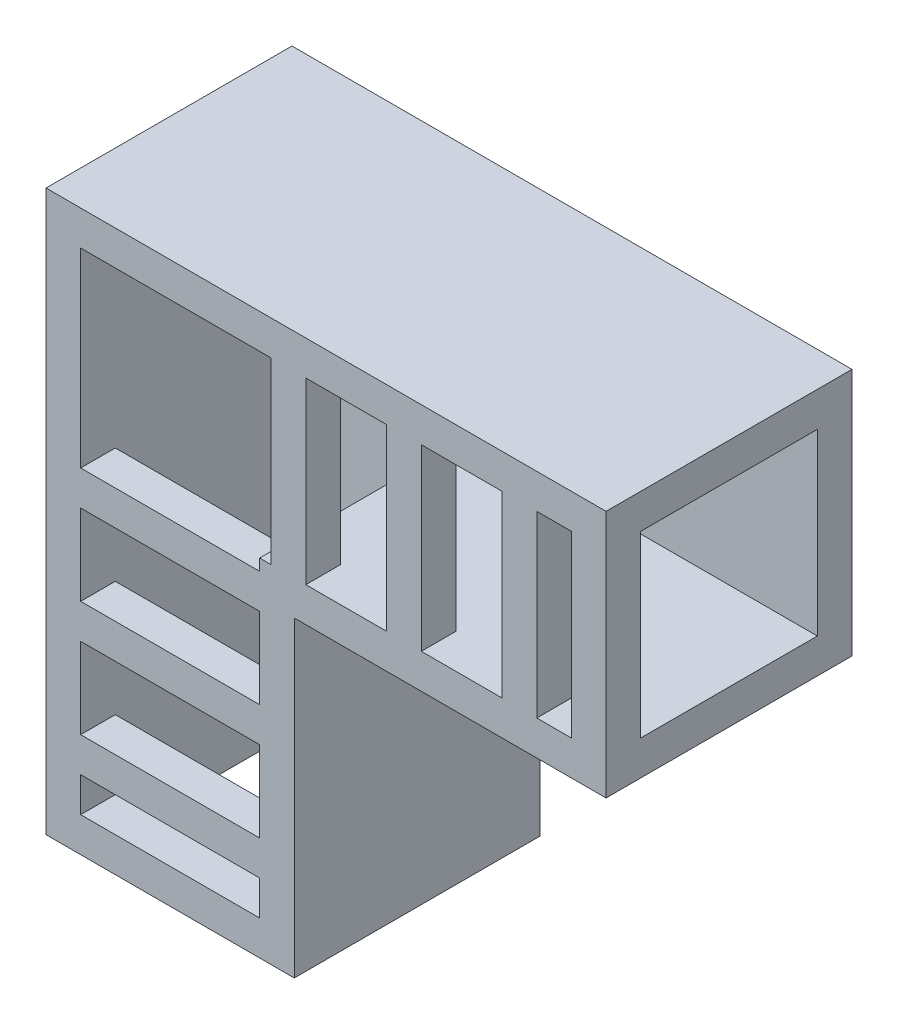
ISO-10303-21;
HEADER;
FILE_DESCRIPTION(('STEP AP214'),'2;1');
FILE_NAME('part.step','',(''),(''),'','','');
FILE_SCHEMA(('AUTOMOTIVE_DESIGN { 1 0 10303 214 1 1 1 1 }'));
ENDSEC;
DATA;
#1=APPLICATION_CONTEXT('core data for automotive mechanical design processes');
#2=APPLICATION_PROTOCOL_DEFINITION('international standard','automotive_design',2000,#1);
#3=PRODUCT_CONTEXT('',#1,'mechanical');
#4=PRODUCT('Part','Part','',(#3));
#5=PRODUCT_RELATED_PRODUCT_CATEGORY('part','',(#4));
#6=PRODUCT_DEFINITION_FORMATION('','',#4);
#7=PRODUCT_DEFINITION_CONTEXT('part definition',#1,'design');
#8=PRODUCT_DEFINITION('design','',#6,#7);
#9=PRODUCT_DEFINITION_SHAPE('','',#8);
#10=(LENGTH_UNIT() NAMED_UNIT(*) SI_UNIT(.MILLI.,.METRE.));
#11=(NAMED_UNIT(*) PLANE_ANGLE_UNIT() SI_UNIT($,.RADIAN.));
#12=(NAMED_UNIT(*) SI_UNIT($,.STERADIAN.) SOLID_ANGLE_UNIT());
#13=UNCERTAINTY_MEASURE_WITH_UNIT(LENGTH_MEASURE(1.E-05),#10,'distance_accuracy_value','');
#14=(GEOMETRIC_REPRESENTATION_CONTEXT(3) GLOBAL_UNCERTAINTY_ASSIGNED_CONTEXT((#13)) GLOBAL_UNIT_ASSIGNED_CONTEXT((#10,
#11,#12)) REPRESENTATION_CONTEXT('',''));
#15=CARTESIAN_POINT('',(0.,0.,0.));
#16=DIRECTION('',(0.,0.,1.));
#17=DIRECTION('',(1.,0.,0.));
#18=AXIS2_PLACEMENT_3D('',#15,#16,#17);
#19=CARTESIAN_POINT('',(0.,0.,18.3));
#20=DIRECTION('',(0.,0.,1.));
#21=DIRECTION('',(1.,0.,0.));
#22=AXIS2_PLACEMENT_3D('',#19,#20,#21);
#23=PLANE('',#22);
#24=DIRECTION('',(1.,0.,0.));
#25=VECTOR('',#24,1.);
#26=CARTESIAN_POINT('',(0.,3.,18.3));
#27=LINE('',#26,#25);
#28=CARTESIAN_POINT('',(0.,3.,18.3));
#29=VERTEX_POINT('',#28);
#30=CARTESIAN_POINT('',(15.5,3.,18.3));
#31=VERTEX_POINT('',#30);
#32=EDGE_CURVE('E47',#29,#31,#27,.T.);
#33=ORIENTED_EDGE('',*,*,#32,.F.);
#34=DIRECTION('',(0.,-1.,0.));
#35=VECTOR('',#34,1.);
#36=CARTESIAN_POINT('',(0.,0.,18.3));
#37=LINE('',#36,#35);
#38=CARTESIAN_POINT('',(0.,6.00000000000001,18.3));
#39=VERTEX_POINT('',#38);
#40=EDGE_CURVE('E413',#39,#29,#37,.T.);
#41=ORIENTED_EDGE('',*,*,#40,.F.);
#42=DIRECTION('',(-1.,0.,0.));
#43=VECTOR('',#42,1.);
#44=CARTESIAN_POINT('',(0.,6.00000000000001,18.3));
#45=LINE('',#44,#43);
#46=CARTESIAN_POINT('',(15.5,6.,18.3));
#47=VERTEX_POINT('',#46);
#48=EDGE_CURVE('E410',#47,#39,#45,.T.);
#49=ORIENTED_EDGE('',*,*,#48,.F.);
#50=DIRECTION('',(0.,1.,0.));
#51=VECTOR('',#50,1.);
#52=CARTESIAN_POINT('',(15.5,0.,18.3));
#53=LINE('',#52,#51);
#54=EDGE_CURVE('E407',#31,#47,#53,.T.);
#55=ORIENTED_EDGE('',*,*,#54,.F.);
#56=EDGE_LOOP('',(#33,#41,#49,#55));
#57=FACE_BOUND('',#56,.T.);
#58=DIRECTION('',(0.,-1.,0.));
#59=VECTOR('',#58,1.);
#60=CARTESIAN_POINT('',(-3.,45.5,18.3));
#61=LINE('',#60,#59);
#62=CARTESIAN_POINT('',(-3.,48.5,18.3));
#63=VERTEX_POINT('',#62);
#64=CARTESIAN_POINT('',(-3.,0.,18.3));
#65=VERTEX_POINT('',#64);
#66=EDGE_CURVE('E507',#63,#65,#61,.T.);
#67=ORIENTED_EDGE('',*,*,#66,.T.);
#68=DIRECTION('',(1.,0.,0.));
#69=VECTOR('',#68,1.);
#70=CARTESIAN_POINT('',(0.,0.,18.3));
#71=LINE('',#70,#69);
#72=CARTESIAN_POINT('',(18.5,0.,18.3));
#73=VERTEX_POINT('',#72);
#74=EDGE_CURVE('E510',#65,#73,#71,.T.);
#75=ORIENTED_EDGE('',*,*,#74,.T.);
#76=DIRECTION('',(0.,1.,0.));
#77=VECTOR('',#76,1.);
#78=CARTESIAN_POINT('',(18.5,0.,18.3));
#79=LINE('',#78,#77);
#80=CARTESIAN_POINT('',(18.5,27.,18.3));
#81=VERTEX_POINT('',#80);
#82=EDGE_CURVE('E521',#73,#81,#79,.T.);
#83=ORIENTED_EDGE('',*,*,#82,.T.);
#84=DIRECTION('',(1.,0.,0.));
#85=VECTOR('',#84,1.);
#86=CARTESIAN_POINT('',(15.5,27.,18.3));
#87=LINE('',#86,#85);
#88=CARTESIAN_POINT('',(45.5,27.,18.3));
#89=VERTEX_POINT('',#88);
#90=EDGE_CURVE('E523',#81,#89,#87,.T.);
#91=ORIENTED_EDGE('',*,*,#90,.T.);
#92=DIRECTION('',(0.,1.,0.));
#93=VECTOR('',#92,1.);
#94=CARTESIAN_POINT('',(45.5,30.,18.3));
#95=LINE('',#94,#93);
#96=CARTESIAN_POINT('',(45.5,48.5,18.3));
#97=VERTEX_POINT('',#96);
#98=EDGE_CURVE('E520',#89,#97,#95,.T.);
#99=ORIENTED_EDGE('',*,*,#98,.T.);
#100=DIRECTION('',(-1.,0.,0.));
#101=VECTOR('',#100,1.);
#102=CARTESIAN_POINT('',(45.5,48.5,18.3));
#103=LINE('',#102,#101);
#104=EDGE_CURVE('E516',#97,#63,#103,.T.);
#105=ORIENTED_EDGE('',*,*,#104,.T.);
#106=EDGE_LOOP('',(#67,#75,#83,#91,#99,#105));
#107=FACE_BOUND('',#106,.T.);
#108=DIRECTION('',(-1.,0.,0.));
#109=VECTOR('',#108,1.);
#110=CARTESIAN_POINT('',(0.,45.5,18.3));
#111=LINE('',#110,#109);
#112=CARTESIAN_POINT('',(16.5,45.5,18.3));
#113=VERTEX_POINT('',#112);
#114=CARTESIAN_POINT('',(0.,45.5,18.3));
#115=VERTEX_POINT('',#114);
#116=EDGE_CURVE('E425',#113,#115,#111,.T.);
#117=ORIENTED_EDGE('',*,*,#116,.F.);
#118=DIRECTION('',(0.,-1.,0.));
#119=VECTOR('',#118,1.);
#120=CARTESIAN_POINT('',(16.5,0.,18.3));
#121=LINE('',#120,#119);
#122=CARTESIAN_POINT('',(16.5,29.9999999999999,18.3));
#123=VERTEX_POINT('',#122);
#124=EDGE_CURVE('E362',#113,#123,#121,.T.);
#125=ORIENTED_EDGE('',*,*,#124,.T.);
#126=DIRECTION('',(1.,0.,0.));
#127=VECTOR('',#126,1.);
#128=CARTESIAN_POINT('',(0.,30.,18.3));
#129=LINE('',#128,#127);
#130=CARTESIAN_POINT('',(15.5,30.,18.3));
#131=VERTEX_POINT('',#130);
#132=EDGE_CURVE('E437',#131,#123,#129,.T.);
#133=ORIENTED_EDGE('',*,*,#132,.F.);
#134=DIRECTION('',(0.,1.,0.));
#135=VECTOR('',#134,1.);
#136=CARTESIAN_POINT('',(15.5,0.,18.3));
#137=LINE('',#136,#135);
#138=CARTESIAN_POINT('',(15.4999999999999,29.,18.3));
#139=VERTEX_POINT('',#138);
#140=EDGE_CURVE('E434',#139,#131,#137,.T.);
#141=ORIENTED_EDGE('',*,*,#140,.F.);
#142=DIRECTION('',(-1.,0.,0.));
#143=VECTOR('',#142,1.);
#144=CARTESIAN_POINT('',(0.,29.,18.3));
#145=LINE('',#144,#143);
#146=CARTESIAN_POINT('',(0.,29.,18.3));
#147=VERTEX_POINT('',#146);
#148=EDGE_CURVE('E431',#139,#147,#145,.T.);
#149=ORIENTED_EDGE('',*,*,#148,.T.);
#150=DIRECTION('',(0.,-1.,0.));
#151=VECTOR('',#150,1.);
#152=CARTESIAN_POINT('',(0.,0.,18.3));
#153=LINE('',#152,#151);
#154=EDGE_CURVE('E428',#115,#147,#153,.T.);
#155=ORIENTED_EDGE('',*,*,#154,.F.);
#156=EDGE_LOOP('',(#117,#125,#133,#141,#149,#155));
#157=FACE_BOUND('',#156,.T.);
#158=DIRECTION('',(0.,1.,0.));
#159=VECTOR('',#158,1.);
#160=CARTESIAN_POINT('',(15.5,0.,18.3));
#161=LINE('',#160,#159);
#162=CARTESIAN_POINT('',(15.5,19.,18.3));
#163=VERTEX_POINT('',#162);
#164=CARTESIAN_POINT('',(15.4999999999999,26.,18.3));
#165=VERTEX_POINT('',#164);
#166=EDGE_CURVE('E327',#163,#165,#161,.T.);
#167=ORIENTED_EDGE('',*,*,#166,.F.);
#168=DIRECTION('',(-1.,0.,0.));
#169=VECTOR('',#168,1.);
#170=CARTESIAN_POINT('',(0.,19.,18.3));
#171=LINE('',#170,#169);
#172=CARTESIAN_POINT('',(0.,19.,18.3));
#173=VERTEX_POINT('',#172);
#174=EDGE_CURVE('E324',#163,#173,#171,.T.);
#175=ORIENTED_EDGE('',*,*,#174,.T.);
#176=DIRECTION('',(0.,-1.,0.));
#177=VECTOR('',#176,1.);
#178=CARTESIAN_POINT('',(0.,0.,18.3));
#179=LINE('',#178,#177);
#180=CARTESIAN_POINT('',(0.,26.,18.3));
#181=VERTEX_POINT('',#180);
#182=EDGE_CURVE('E334',#181,#173,#179,.T.);
#183=ORIENTED_EDGE('',*,*,#182,.F.);
#184=DIRECTION('',(-1.,0.,0.));
#185=VECTOR('',#184,1.);
#186=CARTESIAN_POINT('',(0.,26.,18.3));
#187=LINE('',#186,#185);
#188=EDGE_CURVE('E331',#165,#181,#187,.T.);
#189=ORIENTED_EDGE('',*,*,#188,.F.);
#190=EDGE_LOOP('',(#167,#175,#183,#189));
#191=FACE_BOUND('',#190,.T.);
#192=DIRECTION('',(1.,0.,0.));
#193=VECTOR('',#192,1.);
#194=CARTESIAN_POINT('',(0.,30.,18.3));
#195=LINE('',#194,#193);
#196=CARTESIAN_POINT('',(39.5,30.,18.3));
#197=VERTEX_POINT('',#196);
#198=CARTESIAN_POINT('',(42.5,30.,18.3));
#199=VERTEX_POINT('',#198);
#200=EDGE_CURVE('E304',#197,#199,#195,.T.);
#201=ORIENTED_EDGE('',*,*,#200,.F.);
#202=DIRECTION('',(0.,1.,0.));
#203=VECTOR('',#202,1.);
#204=CARTESIAN_POINT('',(39.5,0.,18.3));
#205=LINE('',#204,#203);
#206=CARTESIAN_POINT('',(39.5,45.5,18.3));
#207=VERTEX_POINT('',#206);
#208=EDGE_CURVE('E310',#197,#207,#205,.T.);
#209=ORIENTED_EDGE('',*,*,#208,.T.);
#210=DIRECTION('',(-1.,0.,0.));
#211=VECTOR('',#210,1.);
#212=CARTESIAN_POINT('',(0.,45.5,18.3));
#213=LINE('',#212,#211);
#214=CARTESIAN_POINT('',(42.5,45.5,18.3));
#215=VERTEX_POINT('',#214);
#216=EDGE_CURVE('E314',#215,#207,#213,.T.);
#217=ORIENTED_EDGE('',*,*,#216,.F.);
#218=DIRECTION('',(0.,1.,0.));
#219=VECTOR('',#218,1.);
#220=CARTESIAN_POINT('',(42.5,0.,18.3));
#221=LINE('',#220,#219);
#222=EDGE_CURVE('E293',#199,#215,#221,.T.);
#223=ORIENTED_EDGE('',*,*,#222,.F.);
#224=EDGE_LOOP('',(#201,#209,#217,#223));
#225=FACE_BOUND('',#224,.T.);
#226=DIRECTION('',(-1.,0.,0.));
#227=VECTOR('',#226,1.);
#228=CARTESIAN_POINT('',(0.,45.5,18.3));
#229=LINE('',#228,#227);
#230=CARTESIAN_POINT('',(36.5,45.5,18.3));
#231=VERTEX_POINT('',#230);
#232=CARTESIAN_POINT('',(29.5,45.4999999999999,18.3));
#233=VERTEX_POINT('',#232);
#234=EDGE_CURVE('E371',#231,#233,#229,.T.);
#235=ORIENTED_EDGE('',*,*,#234,.F.);
#236=DIRECTION('',(0.,-1.,0.));
#237=VECTOR('',#236,1.);
#238=CARTESIAN_POINT('',(36.5,0.,18.3));
#239=LINE('',#238,#237);
#240=CARTESIAN_POINT('',(36.5,30.,18.3));
#241=VERTEX_POINT('',#240);
#242=EDGE_CURVE('E321',#231,#241,#239,.T.);
#243=ORIENTED_EDGE('',*,*,#242,.T.);
#244=DIRECTION('',(1.,0.,0.));
#245=VECTOR('',#244,1.);
#246=CARTESIAN_POINT('',(0.,30.,18.3));
#247=LINE('',#246,#245);
#248=CARTESIAN_POINT('',(29.5,29.9999999999999,18.3));
#249=VERTEX_POINT('',#248);
#250=EDGE_CURVE('E377',#249,#241,#247,.T.);
#251=ORIENTED_EDGE('',*,*,#250,.F.);
#252=DIRECTION('',(0.,1.,0.));
#253=VECTOR('',#252,1.);
#254=CARTESIAN_POINT('',(29.5,0.,18.3));
#255=LINE('',#254,#253);
#256=EDGE_CURVE('E374',#249,#233,#255,.T.);
#257=ORIENTED_EDGE('',*,*,#256,.T.);
#258=EDGE_LOOP('',(#235,#243,#251,#257));
#259=FACE_BOUND('',#258,.T.);
#260=DIRECTION('',(-1.,0.,0.));
#261=VECTOR('',#260,1.);
#262=CARTESIAN_POINT('',(0.,45.5,18.3));
#263=LINE('',#262,#261);
#264=CARTESIAN_POINT('',(26.5,45.5,18.3));
#265=VERTEX_POINT('',#264);
#266=CARTESIAN_POINT('',(19.5,45.4999999999999,18.3));
#267=VERTEX_POINT('',#266);
#268=EDGE_CURVE('E349',#265,#267,#263,.T.);
#269=ORIENTED_EDGE('',*,*,#268,.F.);
#270=DIRECTION('',(0.,-1.,0.));
#271=VECTOR('',#270,1.);
#272=CARTESIAN_POINT('',(26.5,0.,18.3));
#273=LINE('',#272,#271);
#274=CARTESIAN_POINT('',(26.5,29.9999999999999,18.3));
#275=VERTEX_POINT('',#274);
#276=EDGE_CURVE('E346',#265,#275,#273,.T.);
#277=ORIENTED_EDGE('',*,*,#276,.T.);
#278=DIRECTION('',(1.,0.,0.));
#279=VECTOR('',#278,1.);
#280=CARTESIAN_POINT('',(0.,30.,18.3));
#281=LINE('',#280,#279);
#282=CARTESIAN_POINT('',(19.5,29.9999999999999,18.3));
#283=VERTEX_POINT('',#282);
#284=EDGE_CURVE('E356',#283,#275,#281,.T.);
#285=ORIENTED_EDGE('',*,*,#284,.F.);
#286=DIRECTION('',(0.,1.,0.));
#287=VECTOR('',#286,1.);
#288=CARTESIAN_POINT('',(19.5,0.,18.3));
#289=LINE('',#288,#287);
#290=EDGE_CURVE('E353',#283,#267,#289,.T.);
#291=ORIENTED_EDGE('',*,*,#290,.T.);
#292=EDGE_LOOP('',(#269,#277,#285,#291));
#293=FACE_BOUND('',#292,.T.);
#294=DIRECTION('',(0.,1.,0.));
#295=VECTOR('',#294,1.);
#296=CARTESIAN_POINT('',(15.5,0.,18.3));
#297=LINE('',#296,#295);
#298=CARTESIAN_POINT('',(15.5,9.00000000000001,18.3));
#299=VERTEX_POINT('',#298);
#300=CARTESIAN_POINT('',(15.5,16.,18.3));
#301=VERTEX_POINT('',#300);
#302=EDGE_CURVE('E389',#299,#301,#297,.T.);
#303=ORIENTED_EDGE('',*,*,#302,.F.);
#304=DIRECTION('',(-1.,0.,0.));
#305=VECTOR('',#304,1.);
#306=CARTESIAN_POINT('',(0.,9.,18.3));
#307=LINE('',#306,#305);
#308=CARTESIAN_POINT('',(0.,9.,18.3));
#309=VERTEX_POINT('',#308);
#310=EDGE_CURVE('E55',#299,#309,#307,.T.);
#311=ORIENTED_EDGE('',*,*,#310,.T.);
#312=DIRECTION('',(0.,-1.,0.));
#313=VECTOR('',#312,1.);
#314=CARTESIAN_POINT('',(0.,0.,18.3));
#315=LINE('',#314,#313);
#316=CARTESIAN_POINT('',(0.,16.,18.3));
#317=VERTEX_POINT('',#316);
#318=EDGE_CURVE('E396',#317,#309,#315,.T.);
#319=ORIENTED_EDGE('',*,*,#318,.F.);
#320=DIRECTION('',(-1.,0.,0.));
#321=VECTOR('',#320,1.);
#322=CARTESIAN_POINT('',(0.,16.,18.3));
#323=LINE('',#322,#321);
#324=EDGE_CURVE('E393',#301,#317,#323,.T.);
#325=ORIENTED_EDGE('',*,*,#324,.F.);
#326=EDGE_LOOP('',(#303,#311,#319,#325));
#327=FACE_BOUND('',#326,.T.);
#328=ADVANCED_FACE('F32',(#57,#107,#157,#191,#225,#259,#293,#327),#23,.T.);
#329=CARTESIAN_POINT('',(0.,0.,15.3));
#330=DIRECTION('',(0.,0.,1.));
#331=DIRECTION('',(1.,0.,0.));
#332=AXIS2_PLACEMENT_3D('',#329,#330,#331);
#333=PLANE('',#332);
#334=DIRECTION('',(0.,-1.,0.));
#335=VECTOR('',#334,1.);
#336=CARTESIAN_POINT('',(0.,45.5,15.3));
#337=LINE('',#336,#335);
#338=CARTESIAN_POINT('',(0.,3.,15.3));
#339=VERTEX_POINT('',#338);
#340=CARTESIAN_POINT('',(0.,0.,15.3));
#341=VERTEX_POINT('',#340);
#342=EDGE_CURVE('E450',#339,#341,#337,.T.);
#343=ORIENTED_EDGE('',*,*,#342,.F.);
#344=DIRECTION('',(1.,0.,0.));
#345=VECTOR('',#344,1.);
#346=CARTESIAN_POINT('',(0.,3.,15.3));
#347=LINE('',#346,#345);
#348=CARTESIAN_POINT('',(15.5,3.,15.3));
#349=VERTEX_POINT('',#348);
#350=EDGE_CURVE('E11',#339,#349,#347,.T.);
#351=ORIENTED_EDGE('',*,*,#350,.T.);
#352=DIRECTION('',(0.,1.,0.));
#353=VECTOR('',#352,1.);
#354=CARTESIAN_POINT('',(15.5,0.,15.3));
#355=LINE('',#354,#353);
#356=CARTESIAN_POINT('',(15.5,0.,15.3));
#357=VERTEX_POINT('',#356);
#358=EDGE_CURVE('E459',#357,#349,#355,.T.);
#359=ORIENTED_EDGE('',*,*,#358,.F.);
#360=DIRECTION('',(1.,0.,0.));
#361=VECTOR('',#360,1.);
#362=CARTESIAN_POINT('',(0.,0.,15.3));
#363=LINE('',#362,#361);
#364=EDGE_CURVE('E455',#341,#357,#363,.T.);
#365=ORIENTED_EDGE('',*,*,#364,.F.);
#366=EDGE_LOOP('',(#343,#351,#359,#365));
#367=FACE_BOUND('',#366,.T.);
#368=ADVANCED_FACE('F636',(#367),#333,.F.);
#369=CARTESIAN_POINT('',(15.5,6.,15.3));
#370=VERTEX_POINT('',#369);
#371=CARTESIAN_POINT('',(15.5,9.00000000000001,15.3));
#372=VERTEX_POINT('',#371);
#373=EDGE_CURVE('E463',#370,#372,#355,.T.);
#374=ORIENTED_EDGE('',*,*,#373,.F.);
#375=DIRECTION('',(-1.,0.,0.));
#376=VECTOR('',#375,1.);
#377=CARTESIAN_POINT('',(0.,6.00000000000001,15.3));
#378=LINE('',#377,#376);
#379=CARTESIAN_POINT('',(0.,6.00000000000001,15.3));
#380=VERTEX_POINT('',#379);
#381=EDGE_CURVE('E40',#370,#380,#378,.T.);
#382=ORIENTED_EDGE('',*,*,#381,.T.);
#383=CARTESIAN_POINT('',(0.,9.,15.3));
#384=VERTEX_POINT('',#383);
#385=EDGE_CURVE('E452',#384,#380,#337,.T.);
#386=ORIENTED_EDGE('',*,*,#385,.F.);
#387=DIRECTION('',(-1.,0.,0.));
#388=VECTOR('',#387,1.);
#389=CARTESIAN_POINT('',(0.,9.,15.3));
#390=LINE('',#389,#388);
#391=EDGE_CURVE('E572',#372,#384,#390,.T.);
#392=ORIENTED_EDGE('',*,*,#391,.F.);
#393=EDGE_LOOP('',(#374,#382,#386,#392));
#394=FACE_BOUND('',#393,.T.);
#395=ADVANCED_FACE('F579',(#394),#333,.F.);
#396=DIRECTION('',(0.,-1.,0.));
#397=VECTOR('',#396,1.);
#398=CARTESIAN_POINT('',(26.5,0.,15.3));
#399=LINE('',#398,#397);
#400=CARTESIAN_POINT('',(26.5,45.4999999999999,15.3));
#401=VERTEX_POINT('',#400);
#402=CARTESIAN_POINT('',(26.5,29.9999999999999,15.3));
#403=VERTEX_POINT('',#402);
#404=EDGE_CURVE('E567',#401,#403,#399,.T.);
#405=ORIENTED_EDGE('',*,*,#404,.F.);
#406=DIRECTION('',(-1.,0.,0.));
#407=VECTOR('',#406,1.);
#408=CARTESIAN_POINT('',(45.5,45.5,15.3));
#409=LINE('',#408,#407);
#410=CARTESIAN_POINT('',(29.5,45.5,15.3));
#411=VERTEX_POINT('',#410);
#412=EDGE_CURVE('E751',#411,#401,#409,.T.);
#413=ORIENTED_EDGE('',*,*,#412,.F.);
#414=DIRECTION('',(0.,1.,0.));
#415=VECTOR('',#414,1.);
#416=CARTESIAN_POINT('',(29.5,0.,15.3));
#417=LINE('',#416,#415);
#418=CARTESIAN_POINT('',(29.5,29.9999999999999,15.3));
#419=VERTEX_POINT('',#418);
#420=EDGE_CURVE('E559',#419,#411,#417,.T.);
#421=ORIENTED_EDGE('',*,*,#420,.F.);
#422=DIRECTION('',(1.,0.,0.));
#423=VECTOR('',#422,1.);
#424=CARTESIAN_POINT('',(15.5,30.,15.3));
#425=LINE('',#424,#423);
#426=EDGE_CURVE('E728',#403,#419,#425,.T.);
#427=ORIENTED_EDGE('',*,*,#426,.F.);
#428=EDGE_LOOP('',(#405,#413,#421,#427));
#429=FACE_BOUND('',#428,.T.);
#430=ADVANCED_FACE('F748',(#429),#333,.F.);
#431=DIRECTION('',(0.,1.,0.));
#432=VECTOR('',#431,1.);
#433=CARTESIAN_POINT('',(19.5,0.,15.3));
#434=LINE('',#433,#432);
#435=CARTESIAN_POINT('',(19.5,29.9999999999999,15.3));
#436=VERTEX_POINT('',#435);
#437=CARTESIAN_POINT('',(19.5,45.5,15.3));
#438=VERTEX_POINT('',#437);
#439=EDGE_CURVE('E564',#436,#438,#434,.T.);
#440=ORIENTED_EDGE('',*,*,#439,.F.);
#441=CARTESIAN_POINT('',(16.5,29.9999999999999,15.3));
#442=VERTEX_POINT('',#441);
#443=EDGE_CURVE('E466',#442,#436,#425,.T.);
#444=ORIENTED_EDGE('',*,*,#443,.F.);
#445=DIRECTION('',(0.,-1.,0.));
#446=VECTOR('',#445,1.);
#447=CARTESIAN_POINT('',(16.5,0.,15.3));
#448=LINE('',#447,#446);
#449=CARTESIAN_POINT('',(16.5,45.4999999999999,15.3));
#450=VERTEX_POINT('',#449);
#451=EDGE_CURVE('E549',#450,#442,#448,.T.);
#452=ORIENTED_EDGE('',*,*,#451,.F.);
#453=EDGE_CURVE('E470',#438,#450,#409,.T.);
#454=ORIENTED_EDGE('',*,*,#453,.F.);
#455=EDGE_LOOP('',(#440,#444,#452,#454));
#456=FACE_BOUND('',#455,.T.);
#457=ADVANCED_FACE('F738',(#456),#333,.F.);
#458=DIRECTION('',(0.,-1.,0.));
#459=VECTOR('',#458,1.);
#460=CARTESIAN_POINT('',(36.5,0.,15.3));
#461=LINE('',#460,#459);
#462=CARTESIAN_POINT('',(36.5,45.5,15.3));
#463=VERTEX_POINT('',#462);
#464=CARTESIAN_POINT('',(36.5,30.,15.3));
#465=VERTEX_POINT('',#464);
#466=EDGE_CURVE('E562',#463,#465,#461,.T.);
#467=ORIENTED_EDGE('',*,*,#466,.F.);
#468=CARTESIAN_POINT('',(39.5,45.5,15.3));
#469=VERTEX_POINT('',#468);
#470=EDGE_CURVE('E475',#469,#463,#409,.T.);
#471=ORIENTED_EDGE('',*,*,#470,.F.);
#472=DIRECTION('',(0.,1.,0.));
#473=VECTOR('',#472,1.);
#474=CARTESIAN_POINT('',(39.5,0.,15.3));
#475=LINE('',#474,#473);
#476=CARTESIAN_POINT('',(39.5,30.,15.3));
#477=VERTEX_POINT('',#476);
#478=EDGE_CURVE('E557',#477,#469,#475,.T.);
#479=ORIENTED_EDGE('',*,*,#478,.F.);
#480=EDGE_CURVE('E465',#465,#477,#425,.T.);
#481=ORIENTED_EDGE('',*,*,#480,.F.);
#482=EDGE_LOOP('',(#467,#471,#479,#481));
#483=FACE_BOUND('',#482,.T.);
#484=ADVANCED_FACE('F726',(#483),#333,.F.);
#485=CARTESIAN_POINT('',(15.5,16.,15.3));
#486=VERTEX_POINT('',#485);
#487=CARTESIAN_POINT('',(15.5,19.,15.3));
#488=VERTEX_POINT('',#487);
#489=EDGE_CURVE('E612',#486,#488,#355,.T.);
#490=ORIENTED_EDGE('',*,*,#489,.F.);
#491=DIRECTION('',(-1.,0.,0.));
#492=VECTOR('',#491,1.);
#493=CARTESIAN_POINT('',(0.,16.,15.3));
#494=LINE('',#493,#492);
#495=CARTESIAN_POINT('',(0.,16.,15.3));
#496=VERTEX_POINT('',#495);
#497=EDGE_CURVE('E569',#486,#496,#494,.T.);
#498=ORIENTED_EDGE('',*,*,#497,.T.);
#499=CARTESIAN_POINT('',(0.,19.,15.3));
#500=VERTEX_POINT('',#499);
#501=EDGE_CURVE('E586',#500,#496,#337,.T.);
#502=ORIENTED_EDGE('',*,*,#501,.F.);
#503=DIRECTION('',(-1.,0.,0.));
#504=VECTOR('',#503,1.);
#505=CARTESIAN_POINT('',(0.,19.,15.3));
#506=LINE('',#505,#504);
#507=EDGE_CURVE('E554',#488,#500,#506,.T.);
#508=ORIENTED_EDGE('',*,*,#507,.F.);
#509=EDGE_LOOP('',(#490,#498,#502,#508));
#510=FACE_BOUND('',#509,.T.);
#511=ADVANCED_FACE('F609',(#510),#333,.F.);
#512=CARTESIAN_POINT('',(42.5,30.,15.3));
#513=VERTEX_POINT('',#512);
#514=CARTESIAN_POINT('',(45.5,30.,15.3));
#515=VERTEX_POINT('',#514);
#516=EDGE_CURVE('E462',#513,#515,#425,.T.);
#517=ORIENTED_EDGE('',*,*,#516,.F.);
#518=DIRECTION('',(0.,1.,0.));
#519=VECTOR('',#518,1.);
#520=CARTESIAN_POINT('',(42.5,0.,15.3));
#521=LINE('',#520,#519);
#522=CARTESIAN_POINT('',(42.5,45.5,15.3));
#523=VERTEX_POINT('',#522);
#524=EDGE_CURVE('E296',#513,#523,#521,.T.);
#525=ORIENTED_EDGE('',*,*,#524,.T.);
#526=CARTESIAN_POINT('',(45.5,45.5,15.3));
#527=VERTEX_POINT('',#526);
#528=EDGE_CURVE('E471',#527,#523,#409,.T.);
#529=ORIENTED_EDGE('',*,*,#528,.F.);
#530=DIRECTION('',(0.,1.,0.));
#531=VECTOR('',#530,1.);
#532=CARTESIAN_POINT('',(45.5,30.,15.3));
#533=LINE('',#532,#531);
#534=EDGE_CURVE('E467',#515,#527,#533,.T.);
#535=ORIENTED_EDGE('',*,*,#534,.F.);
#536=EDGE_LOOP('',(#517,#525,#529,#535));
#537=FACE_BOUND('',#536,.T.);
#538=ADVANCED_FACE('F716',(#537),#333,.F.);
#539=CARTESIAN_POINT('',(15.5,26.,15.3));
#540=VERTEX_POINT('',#539);
#541=CARTESIAN_POINT('',(15.4999999999999,29.,15.3));
#542=VERTEX_POINT('',#541);
#543=EDGE_CURVE('E458',#540,#542,#355,.T.);
#544=ORIENTED_EDGE('',*,*,#543,.F.);
#545=DIRECTION('',(-1.,0.,0.));
#546=VECTOR('',#545,1.);
#547=CARTESIAN_POINT('',(0.,26.,15.3));
#548=LINE('',#547,#546);
#549=CARTESIAN_POINT('',(0.,26.,15.3));
#550=VERTEX_POINT('',#549);
#551=EDGE_CURVE('E551',#540,#550,#548,.T.);
#552=ORIENTED_EDGE('',*,*,#551,.T.);
#553=CARTESIAN_POINT('',(0.,29.,15.3));
#554=VERTEX_POINT('',#553);
#555=EDGE_CURVE('E454',#554,#550,#337,.T.);
#556=ORIENTED_EDGE('',*,*,#555,.F.);
#557=DIRECTION('',(-1.,0.,0.));
#558=VECTOR('',#557,1.);
#559=CARTESIAN_POINT('',(0.,29.,15.3));
#560=LINE('',#559,#558);
#561=EDGE_CURVE('E537',#542,#554,#560,.T.);
#562=ORIENTED_EDGE('',*,*,#561,.F.);
#563=EDGE_LOOP('',(#544,#552,#556,#562));
#564=FACE_BOUND('',#563,.T.);
#565=ADVANCED_FACE('F596',(#564),#333,.F.);
#566=CARTESIAN_POINT('',(0.,0.,15.3));
#567=DIRECTION('',(0.,1.,0.));
#568=DIRECTION('',(0.,0.,1.));
#569=AXIS2_PLACEMENT_3D('',#566,#567,#568);
#570=PLANE('',#569);
#571=DIRECTION('',(1.,0.,0.));
#572=VECTOR('',#571,1.);
#573=CARTESIAN_POINT('',(0.,0.,-3.));
#574=LINE('',#573,#572);
#575=CARTESIAN_POINT('',(-3.,0.,-3.));
#576=VERTEX_POINT('',#575);
#577=CARTESIAN_POINT('',(18.5,0.,-3.));
#578=VERTEX_POINT('',#577);
#579=EDGE_CURVE('E506',#576,#578,#574,.T.);
#580=ORIENTED_EDGE('',*,*,#579,.T.);
#581=DIRECTION('',(0.,0.,-1.));
#582=VECTOR('',#581,1.);
#583=CARTESIAN_POINT('',(18.5,0.,15.3));
#584=LINE('',#583,#582);
#585=EDGE_CURVE('E531',#73,#578,#584,.T.);
#586=ORIENTED_EDGE('',*,*,#585,.F.);
#587=ORIENTED_EDGE('',*,*,#74,.F.);
#588=DIRECTION('',(0.,0.,-1.));
#589=VECTOR('',#588,1.);
#590=CARTESIAN_POINT('',(-3.,0.,15.3));
#591=LINE('',#590,#589);
#592=EDGE_CURVE('E534',#65,#576,#591,.T.);
#593=ORIENTED_EDGE('',*,*,#592,.T.);
#594=EDGE_LOOP('',(#580,#586,#587,#593));
#595=FACE_BOUND('',#594,.T.);
#596=DIRECTION('',(1.,0.,0.));
#597=VECTOR('',#596,1.);
#598=CARTESIAN_POINT('',(0.,0.,0.));
#599=LINE('',#598,#597);
#600=CARTESIAN_POINT('',(0.,0.,0.));
#601=VERTEX_POINT('',#600);
#602=CARTESIAN_POINT('',(15.5,0.,0.));
#603=VERTEX_POINT('',#602);
#604=EDGE_CURVE('E478',#601,#603,#599,.T.);
#605=ORIENTED_EDGE('',*,*,#604,.F.);
#606=DIRECTION('',(0.,0.,-1.));
#607=VECTOR('',#606,1.);
#608=CARTESIAN_POINT('',(0.,0.,15.3));
#609=LINE('',#608,#607);
#610=EDGE_CURVE('E501',#341,#601,#609,.T.);
#611=ORIENTED_EDGE('',*,*,#610,.F.);
#612=ORIENTED_EDGE('',*,*,#364,.T.);
#613=DIRECTION('',(0.,0.,-1.));
#614=VECTOR('',#613,1.);
#615=CARTESIAN_POINT('',(15.5,0.,15.3));
#616=LINE('',#615,#614);
#617=EDGE_CURVE('E498',#357,#603,#616,.T.);
#618=ORIENTED_EDGE('',*,*,#617,.T.);
#619=EDGE_LOOP('',(#605,#611,#612,#618));
#620=FACE_BOUND('',#619,.T.);
#621=ADVANCED_FACE('F662',(#595,#620),#570,.F.);
#622=CARTESIAN_POINT('',(45.5,30.,15.3));
#623=DIRECTION('',(-1.,0.,0.));
#624=DIRECTION('',(0.,0.,1.));
#625=AXIS2_PLACEMENT_3D('',#622,#623,#624);
#626=PLANE('',#625);
#627=DIRECTION('',(0.,1.,0.));
#628=VECTOR('',#627,1.);
#629=CARTESIAN_POINT('',(45.5,30.,-3.));
#630=LINE('',#629,#628);
#631=CARTESIAN_POINT('',(45.5,27.,-3.));
#632=VERTEX_POINT('',#631);
#633=CARTESIAN_POINT('',(45.5,48.5,-3.));
#634=VERTEX_POINT('',#633);
#635=EDGE_CURVE('E518',#632,#634,#630,.T.);
#636=ORIENTED_EDGE('',*,*,#635,.T.);
#637=DIRECTION('',(0.,0.,-1.));
#638=VECTOR('',#637,1.);
#639=CARTESIAN_POINT('',(45.5,48.5,15.3));
#640=LINE('',#639,#638);
#641=EDGE_CURVE('E515',#97,#634,#640,.T.);
#642=ORIENTED_EDGE('',*,*,#641,.F.);
#643=ORIENTED_EDGE('',*,*,#98,.F.);
#644=DIRECTION('',(0.,0.,-1.));
#645=VECTOR('',#644,1.);
#646=CARTESIAN_POINT('',(45.5,27.,15.3));
#647=LINE('',#646,#645);
#648=EDGE_CURVE('E532',#89,#632,#647,.T.);
#649=ORIENTED_EDGE('',*,*,#648,.T.);
#650=EDGE_LOOP('',(#636,#642,#643,#649));
#651=FACE_BOUND('',#650,.T.);
#652=DIRECTION('',(0.,1.,0.));
#653=VECTOR('',#652,1.);
#654=CARTESIAN_POINT('',(45.5,30.,0.));
#655=LINE('',#654,#653);
#656=CARTESIAN_POINT('',(45.5,30.,0.));
#657=VERTEX_POINT('',#656);
#658=CARTESIAN_POINT('',(45.5,45.5,0.));
#659=VERTEX_POINT('',#658);
#660=EDGE_CURVE('E485',#657,#659,#655,.T.);
#661=ORIENTED_EDGE('',*,*,#660,.F.);
#662=DIRECTION('',(0.,0.,-1.));
#663=VECTOR('',#662,1.);
#664=CARTESIAN_POINT('',(45.5,30.,15.3));
#665=LINE('',#664,#663);
#666=EDGE_CURVE('E493',#515,#657,#665,.T.);
#667=ORIENTED_EDGE('',*,*,#666,.F.);
#668=ORIENTED_EDGE('',*,*,#534,.T.);
#669=DIRECTION('',(0.,0.,-1.));
#670=VECTOR('',#669,1.);
#671=CARTESIAN_POINT('',(45.5,45.5,15.3));
#672=LINE('',#671,#670);
#673=EDGE_CURVE('E490',#527,#659,#672,.T.);
#674=ORIENTED_EDGE('',*,*,#673,.T.);
#675=EDGE_LOOP('',(#661,#667,#668,#674));
#676=FACE_BOUND('',#675,.T.);
#677=ADVANCED_FACE('F660',(#651,#676),#626,.F.);
#678=CARTESIAN_POINT('',(-3.,45.5,15.3));
#679=DIRECTION('',(1.,0.,0.));
#680=DIRECTION('',(0.,0.,-1.));
#681=AXIS2_PLACEMENT_3D('',#678,#679,#680);
#682=PLANE('',#681);
#683=DIRECTION('',(0.,-1.,0.));
#684=VECTOR('',#683,1.);
#685=CARTESIAN_POINT('',(-3.,45.5,-3.));
#686=LINE('',#685,#684);
#687=CARTESIAN_POINT('',(-3.,48.5,-3.));
#688=VERTEX_POINT('',#687);
#689=EDGE_CURVE('E503',#688,#576,#686,.T.);
#690=ORIENTED_EDGE('',*,*,#689,.T.);
#691=ORIENTED_EDGE('',*,*,#592,.F.);
#692=ORIENTED_EDGE('',*,*,#66,.F.);
#693=DIRECTION('',(0.,0.,-1.));
#694=VECTOR('',#693,1.);
#695=CARTESIAN_POINT('',(-3.,48.5,15.3));
#696=LINE('',#695,#694);
#697=EDGE_CURVE('E512',#63,#688,#696,.T.);
#698=ORIENTED_EDGE('',*,*,#697,.T.);
#699=EDGE_LOOP('',(#690,#691,#692,#698));
#700=FACE_BOUND('',#699,.T.);
#701=ADVANCED_FACE('F656',(#700),#682,.F.);
#702=CARTESIAN_POINT('',(18.5,0.,15.3));
#703=DIRECTION('',(-1.,0.,0.));
#704=DIRECTION('',(0.,0.,1.));
#705=AXIS2_PLACEMENT_3D('',#702,#703,#704);
#706=PLANE('',#705);
#707=DIRECTION('',(0.,1.,0.));
#708=VECTOR('',#707,1.);
#709=CARTESIAN_POINT('',(18.5,0.,-3.));
#710=LINE('',#709,#708);
#711=CARTESIAN_POINT('',(18.5,27.,-3.));
#712=VERTEX_POINT('',#711);
#713=EDGE_CURVE('E525',#578,#712,#710,.T.);
#714=ORIENTED_EDGE('',*,*,#713,.T.);
#715=DIRECTION('',(0.,0.,-1.));
#716=VECTOR('',#715,1.);
#717=CARTESIAN_POINT('',(18.5,27.,15.3));
#718=LINE('',#717,#716);
#719=EDGE_CURVE('E528',#81,#712,#718,.T.);
#720=ORIENTED_EDGE('',*,*,#719,.F.);
#721=ORIENTED_EDGE('',*,*,#82,.F.);
#722=ORIENTED_EDGE('',*,*,#585,.T.);
#723=EDGE_LOOP('',(#714,#720,#721,#722));
#724=FACE_BOUND('',#723,.T.);
#725=ADVANCED_FACE('F652',(#724),#706,.F.);
#726=CARTESIAN_POINT('',(15.5,27.,15.3));
#727=DIRECTION('',(0.,1.,0.));
#728=DIRECTION('',(0.,0.,1.));
#729=AXIS2_PLACEMENT_3D('',#726,#727,#728);
#730=PLANE('',#729);
#731=DIRECTION('',(1.,0.,0.));
#732=VECTOR('',#731,1.);
#733=CARTESIAN_POINT('',(15.5,27.,-3.));
#734=LINE('',#733,#732);
#735=EDGE_CURVE('E527',#712,#632,#734,.T.);
#736=ORIENTED_EDGE('',*,*,#735,.T.);
#737=ORIENTED_EDGE('',*,*,#648,.F.);
#738=ORIENTED_EDGE('',*,*,#90,.F.);
#739=ORIENTED_EDGE('',*,*,#719,.T.);
#740=EDGE_LOOP('',(#736,#737,#738,#739));
#741=FACE_BOUND('',#740,.T.);
#742=ADVANCED_FACE('F648',(#741),#730,.F.);
#743=CARTESIAN_POINT('',(45.5,48.5,15.3));
#744=DIRECTION('',(0.,-1.,0.));
#745=DIRECTION('',(1.,0.,0.));
#746=AXIS2_PLACEMENT_3D('',#743,#744,#745);
#747=PLANE('',#746);
#748=DIRECTION('',(-1.,0.,0.));
#749=VECTOR('',#748,1.);
#750=CARTESIAN_POINT('',(45.5,48.5,-3.));
#751=LINE('',#750,#749);
#752=EDGE_CURVE('E511',#634,#688,#751,.T.);
#753=ORIENTED_EDGE('',*,*,#752,.T.);
#754=ORIENTED_EDGE('',*,*,#697,.F.);
#755=ORIENTED_EDGE('',*,*,#104,.F.);
#756=ORIENTED_EDGE('',*,*,#641,.T.);
#757=EDGE_LOOP('',(#753,#754,#755,#756));
#758=FACE_BOUND('',#757,.T.);
#759=ADVANCED_FACE('F645',(#758),#747,.F.);
#760=CARTESIAN_POINT('',(0.,0.,-3.));
#761=DIRECTION('',(0.,0.,1.));
#762=DIRECTION('',(1.,0.,0.));
#763=AXIS2_PLACEMENT_3D('',#760,#761,#762);
#764=PLANE('',#763);
#765=ORIENTED_EDGE('',*,*,#689,.F.);
#766=ORIENTED_EDGE('',*,*,#752,.F.);
#767=ORIENTED_EDGE('',*,*,#635,.F.);
#768=ORIENTED_EDGE('',*,*,#735,.F.);
#769=ORIENTED_EDGE('',*,*,#713,.F.);
#770=ORIENTED_EDGE('',*,*,#579,.F.);
#771=EDGE_LOOP('',(#765,#766,#767,#768,#769,#770));
#772=FACE_BOUND('',#771,.T.);
#773=ADVANCED_FACE('F34',(#772),#764,.F.);
#774=CARTESIAN_POINT('',(0.,45.5,15.3));
#775=DIRECTION('',(1.,0.,0.));
#776=DIRECTION('',(0.,0.,-1.));
#777=AXIS2_PLACEMENT_3D('',#774,#775,#776);
#778=PLANE('',#777);
#779=ORIENTED_EDGE('',*,*,#385,.T.);
#780=DIRECTION('',(0.,0.,1.));
#781=VECTOR('',#780,1.);
#782=CARTESIAN_POINT('',(0.,6.00000000000001,13.3));
#783=LINE('',#782,#781);
#784=EDGE_CURVE('E418',#380,#39,#783,.T.);
#785=ORIENTED_EDGE('',*,*,#784,.T.);
#786=ORIENTED_EDGE('',*,*,#40,.T.);
#787=DIRECTION('',(0.,0.,1.));
#788=VECTOR('',#787,1.);
#789=CARTESIAN_POINT('',(0.,3.,13.3));
#790=LINE('',#789,#788);
#791=EDGE_CURVE('E390',#339,#29,#790,.T.);
#792=ORIENTED_EDGE('',*,*,#791,.F.);
#793=ORIENTED_EDGE('',*,*,#342,.T.);
#794=ORIENTED_EDGE('',*,*,#610,.T.);
#795=DIRECTION('',(0.,-1.,0.));
#796=VECTOR('',#795,1.);
#797=CARTESIAN_POINT('',(0.,45.5,0.));
#798=LINE('',#797,#796);
#799=CARTESIAN_POINT('',(0.,45.5,0.));
#800=VERTEX_POINT('',#799);
#801=EDGE_CURVE('E443',#800,#601,#798,.T.);
#802=ORIENTED_EDGE('',*,*,#801,.F.);
#803=DIRECTION('',(0.,0.,-1.));
#804=VECTOR('',#803,1.);
#805=CARTESIAN_POINT('',(0.,45.5,15.3));
#806=LINE('',#805,#804);
#807=EDGE_CURVE('E474',#115,#800,#806,.T.);
#808=ORIENTED_EDGE('',*,*,#807,.F.);
#809=ORIENTED_EDGE('',*,*,#154,.T.);
#810=DIRECTION('',(0.,0.,1.));
#811=VECTOR('',#810,1.);
#812=CARTESIAN_POINT('',(0.,29.,13.3));
#813=LINE('',#812,#811);
#814=EDGE_CURVE('E446',#554,#147,#813,.T.);
#815=ORIENTED_EDGE('',*,*,#814,.F.);
#816=ORIENTED_EDGE('',*,*,#555,.T.);
#817=DIRECTION('',(0.,0.,1.));
#818=VECTOR('',#817,1.);
#819=CARTESIAN_POINT('',(0.,26.,13.3));
#820=LINE('',#819,#818);
#821=EDGE_CURVE('E340',#550,#181,#820,.T.);
#822=ORIENTED_EDGE('',*,*,#821,.T.);
#823=ORIENTED_EDGE('',*,*,#182,.T.);
#824=DIRECTION('',(0.,0.,1.));
#825=VECTOR('',#824,1.);
#826=CARTESIAN_POINT('',(0.,19.,13.3));
#827=LINE('',#826,#825);
#828=EDGE_CURVE('E338',#500,#173,#827,.T.);
#829=ORIENTED_EDGE('',*,*,#828,.F.);
#830=ORIENTED_EDGE('',*,*,#501,.T.);
#831=DIRECTION('',(0.,0.,1.));
#832=VECTOR('',#831,1.);
#833=CARTESIAN_POINT('',(0.,16.,13.3));
#834=LINE('',#833,#832);
#835=EDGE_CURVE('E401',#496,#317,#834,.T.);
#836=ORIENTED_EDGE('',*,*,#835,.T.);
#837=ORIENTED_EDGE('',*,*,#318,.T.);
#838=DIRECTION('',(0.,0.,1.));
#839=VECTOR('',#838,1.);
#840=CARTESIAN_POINT('',(0.,9.,13.3));
#841=LINE('',#840,#839);
#842=EDGE_CURVE('E328',#384,#309,#841,.T.);
#843=ORIENTED_EDGE('',*,*,#842,.F.);
#844=EDGE_LOOP('',(#779,#785,#786,#792,#793,#794,#802,#808,#809,#815,#816,#822,#823,#829,#830,
#836,#837,#843));
#845=FACE_BOUND('',#844,.T.);
#846=ADVANCED_FACE('F585',(#845),#778,.T.);
#847=CARTESIAN_POINT('',(15.5,0.,15.3));
#848=DIRECTION('',(-1.,0.,0.));
#849=DIRECTION('',(0.,0.,1.));
#850=AXIS2_PLACEMENT_3D('',#847,#848,#849);
#851=PLANE('',#850);
#852=ORIENTED_EDGE('',*,*,#358,.T.);
#853=DIRECTION('',(0.,0.,1.));
#854=VECTOR('',#853,1.);
#855=CARTESIAN_POINT('',(15.5,3.,13.3));
#856=LINE('',#855,#854);
#857=EDGE_CURVE('E416',#349,#31,#856,.T.);
#858=ORIENTED_EDGE('',*,*,#857,.T.);
#859=ORIENTED_EDGE('',*,*,#54,.T.);
#860=DIRECTION('',(0.,0.,1.));
#861=VECTOR('',#860,1.);
#862=CARTESIAN_POINT('',(15.5,6.,13.3));
#863=LINE('',#862,#861);
#864=EDGE_CURVE('E420',#370,#47,#863,.T.);
#865=ORIENTED_EDGE('',*,*,#864,.F.);
#866=ORIENTED_EDGE('',*,*,#373,.T.);
#867=DIRECTION('',(0.,0.,1.));
#868=VECTOR('',#867,1.);
#869=CARTESIAN_POINT('',(15.5,9.00000000000001,13.3));
#870=LINE('',#869,#868);
#871=EDGE_CURVE('E399',#372,#299,#870,.T.);
#872=ORIENTED_EDGE('',*,*,#871,.T.);
#873=ORIENTED_EDGE('',*,*,#302,.T.);
#874=DIRECTION('',(0.,0.,1.));
#875=VECTOR('',#874,1.);
#876=CARTESIAN_POINT('',(15.5,16.,13.3));
#877=LINE('',#876,#875);
#878=EDGE_CURVE('E403',#486,#301,#877,.T.);
#879=ORIENTED_EDGE('',*,*,#878,.F.);
#880=ORIENTED_EDGE('',*,*,#489,.T.);
#881=DIRECTION('',(0.,0.,1.));
#882=VECTOR('',#881,1.);
#883=CARTESIAN_POINT('',(15.5,19.,13.3));
#884=LINE('',#883,#882);
#885=EDGE_CURVE('E337',#488,#163,#884,.T.);
#886=ORIENTED_EDGE('',*,*,#885,.T.);
#887=ORIENTED_EDGE('',*,*,#166,.T.);
#888=DIRECTION('',(0.,0.,1.));
#889=VECTOR('',#888,1.);
#890=CARTESIAN_POINT('',(15.4999999999999,26.,13.3));
#891=LINE('',#890,#889);
#892=EDGE_CURVE('E342',#540,#165,#891,.T.);
#893=ORIENTED_EDGE('',*,*,#892,.F.);
#894=ORIENTED_EDGE('',*,*,#543,.T.);
#895=DIRECTION('',(0.,0.,1.));
#896=VECTOR('',#895,1.);
#897=CARTESIAN_POINT('',(15.4999999999999,29.,13.3));
#898=LINE('',#897,#896);
#899=EDGE_CURVE('E444',#542,#139,#898,.T.);
#900=ORIENTED_EDGE('',*,*,#899,.T.);
#901=ORIENTED_EDGE('',*,*,#140,.T.);
#902=DIRECTION('',(0.,0.,-1.));
#903=VECTOR('',#902,1.);
#904=CARTESIAN_POINT('',(15.5,30.,15.3));
#905=LINE('',#904,#903);
#906=CARTESIAN_POINT('',(15.5,30.,0.));
#907=VERTEX_POINT('',#906);
#908=EDGE_CURVE('E496',#131,#907,#905,.T.);
#909=ORIENTED_EDGE('',*,*,#908,.T.);
#910=DIRECTION('',(0.,1.,0.));
#911=VECTOR('',#910,1.);
#912=CARTESIAN_POINT('',(15.5,0.,0.));
#913=LINE('',#912,#911);
#914=EDGE_CURVE('E480',#603,#907,#913,.T.);
#915=ORIENTED_EDGE('',*,*,#914,.F.);
#916=ORIENTED_EDGE('',*,*,#617,.F.);
#917=EDGE_LOOP('',(#852,#858,#859,#865,#866,#872,#873,#879,#880,#886,#887,#893,#894,#900,#901,
#909,#915,#916));
#918=FACE_BOUND('',#917,.T.);
#919=ADVANCED_FACE('F620',(#918),#851,.T.);
#920=CARTESIAN_POINT('',(15.5,30.,15.3));
#921=DIRECTION('',(0.,1.,0.));
#922=DIRECTION('',(0.,0.,1.));
#923=AXIS2_PLACEMENT_3D('',#920,#921,#922);
#924=PLANE('',#923);
#925=DIRECTION('',(0.,0.,1.));
#926=VECTOR('',#925,1.);
#927=CARTESIAN_POINT('',(26.5,29.9999999999999,13.3));
#928=LINE('',#927,#926);
#929=EDGE_CURVE('E360',#403,#275,#928,.T.);
#930=ORIENTED_EDGE('',*,*,#929,.F.);
#931=ORIENTED_EDGE('',*,*,#426,.T.);
#932=DIRECTION('',(0.,0.,1.));
#933=VECTOR('',#932,1.);
#934=CARTESIAN_POINT('',(29.5,29.9999999999999,13.3));
#935=LINE('',#934,#933);
#936=EDGE_CURVE('E382',#419,#249,#935,.T.);
#937=ORIENTED_EDGE('',*,*,#936,.T.);
#938=ORIENTED_EDGE('',*,*,#250,.T.);
#939=DIRECTION('',(0.,0.,1.));
#940=VECTOR('',#939,1.);
#941=CARTESIAN_POINT('',(36.5,30.,13.3));
#942=LINE('',#941,#940);
#943=EDGE_CURVE('E350',#465,#241,#942,.T.);
#944=ORIENTED_EDGE('',*,*,#943,.F.);
#945=ORIENTED_EDGE('',*,*,#480,.T.);
#946=DIRECTION('',(0.,0.,1.));
#947=VECTOR('',#946,1.);
#948=CARTESIAN_POINT('',(39.5,30.,13.3));
#949=LINE('',#948,#947);
#950=EDGE_CURVE('E300',#477,#197,#949,.T.);
#951=ORIENTED_EDGE('',*,*,#950,.T.);
#952=ORIENTED_EDGE('',*,*,#200,.T.);
#953=DIRECTION('',(0.,0.,1.));
#954=VECTOR('',#953,1.);
#955=CARTESIAN_POINT('',(42.5,30.,13.3));
#956=LINE('',#955,#954);
#957=EDGE_CURVE('E289',#513,#199,#956,.T.);
#958=ORIENTED_EDGE('',*,*,#957,.F.);
#959=ORIENTED_EDGE('',*,*,#516,.T.);
#960=ORIENTED_EDGE('',*,*,#666,.T.);
#961=DIRECTION('',(1.,0.,0.));
#962=VECTOR('',#961,1.);
#963=CARTESIAN_POINT('',(15.5,30.,0.));
#964=LINE('',#963,#962);
#965=EDGE_CURVE('E483',#907,#657,#964,.T.);
#966=ORIENTED_EDGE('',*,*,#965,.F.);
#967=ORIENTED_EDGE('',*,*,#908,.F.);
#968=ORIENTED_EDGE('',*,*,#132,.T.);
#969=DIRECTION('',(0.,0.,1.));
#970=VECTOR('',#969,1.);
#971=CARTESIAN_POINT('',(16.5,29.9999999999999,13.3));
#972=LINE('',#971,#970);
#973=EDGE_CURVE('E441',#442,#123,#972,.T.);
#974=ORIENTED_EDGE('',*,*,#973,.F.);
#975=ORIENTED_EDGE('',*,*,#443,.T.);
#976=DIRECTION('',(0.,0.,1.));
#977=VECTOR('',#976,1.);
#978=CARTESIAN_POINT('',(19.5,29.9999999999999,13.3));
#979=LINE('',#978,#977);
#980=EDGE_CURVE('E363',#436,#283,#979,.T.);
#981=ORIENTED_EDGE('',*,*,#980,.T.);
#982=ORIENTED_EDGE('',*,*,#284,.T.);
#983=EDGE_LOOP('',(#930,#931,#937,#938,#944,#945,#951,#952,#958,#959,#960,#966,#967,#968,#974,
#975,#981,#982));
#984=FACE_BOUND('',#983,.T.);
#985=ADVANCED_FACE('F306',(#984),#924,.T.);
#986=CARTESIAN_POINT('',(45.5,45.5,15.3));
#987=DIRECTION('',(0.,-1.,0.));
#988=DIRECTION('',(1.,0.,0.));
#989=AXIS2_PLACEMENT_3D('',#986,#987,#988);
#990=PLANE('',#989);
#991=DIRECTION('',(0.,0.,1.));
#992=VECTOR('',#991,1.);
#993=CARTESIAN_POINT('',(19.5,45.4999999999999,13.3));
#994=LINE('',#993,#992);
#995=EDGE_CURVE('E365',#438,#267,#994,.T.);
#996=ORIENTED_EDGE('',*,*,#995,.F.);
#997=ORIENTED_EDGE('',*,*,#453,.T.);
#998=DIRECTION('',(0.,0.,1.));
#999=VECTOR('',#998,1.);
#1000=CARTESIAN_POINT('',(16.5,45.4999999999999,13.3));
#1001=LINE('',#1000,#999);
#1002=EDGE_CURVE('E440',#450,#113,#1001,.T.);
#1003=ORIENTED_EDGE('',*,*,#1002,.T.);
#1004=ORIENTED_EDGE('',*,*,#116,.T.);
#1005=ORIENTED_EDGE('',*,*,#807,.T.);
#1006=DIRECTION('',(-1.,0.,0.));
#1007=VECTOR('',#1006,1.);
#1008=CARTESIAN_POINT('',(45.5,45.5,0.));
#1009=LINE('',#1008,#1007);
#1010=EDGE_CURVE('E453',#659,#800,#1009,.T.);
#1011=ORIENTED_EDGE('',*,*,#1010,.F.);
#1012=ORIENTED_EDGE('',*,*,#673,.F.);
#1013=ORIENTED_EDGE('',*,*,#528,.T.);
#1014=DIRECTION('',(0.,0.,1.));
#1015=VECTOR('',#1014,1.);
#1016=CARTESIAN_POINT('',(42.5,45.5,13.3));
#1017=LINE('',#1016,#1015);
#1018=EDGE_CURVE('E299',#523,#215,#1017,.T.);
#1019=ORIENTED_EDGE('',*,*,#1018,.T.);
#1020=ORIENTED_EDGE('',*,*,#216,.T.);
#1021=DIRECTION('',(0.,0.,1.));
#1022=VECTOR('',#1021,1.);
#1023=CARTESIAN_POINT('',(39.5,45.5,13.3));
#1024=LINE('',#1023,#1022);
#1025=EDGE_CURVE('E319',#469,#207,#1024,.T.);
#1026=ORIENTED_EDGE('',*,*,#1025,.F.);
#1027=ORIENTED_EDGE('',*,*,#470,.T.);
#1028=DIRECTION('',(0.,0.,1.));
#1029=VECTOR('',#1028,1.);
#1030=CARTESIAN_POINT('',(36.5,45.5,13.3));
#1031=LINE('',#1030,#1029);
#1032=EDGE_CURVE('E380',#463,#231,#1031,.T.);
#1033=ORIENTED_EDGE('',*,*,#1032,.T.);
#1034=ORIENTED_EDGE('',*,*,#234,.T.);
#1035=DIRECTION('',(0.,0.,1.));
#1036=VECTOR('',#1035,1.);
#1037=CARTESIAN_POINT('',(29.5,45.4999999999999,13.3));
#1038=LINE('',#1037,#1036);
#1039=EDGE_CURVE('E384',#411,#233,#1038,.T.);
#1040=ORIENTED_EDGE('',*,*,#1039,.F.);
#1041=ORIENTED_EDGE('',*,*,#412,.T.);
#1042=DIRECTION('',(0.,0.,1.));
#1043=VECTOR('',#1042,1.);
#1044=CARTESIAN_POINT('',(26.5,45.4999999999999,13.3));
#1045=LINE('',#1044,#1043);
#1046=EDGE_CURVE('E359',#401,#265,#1045,.T.);
#1047=ORIENTED_EDGE('',*,*,#1046,.T.);
#1048=ORIENTED_EDGE('',*,*,#268,.T.);
#1049=EDGE_LOOP('',(#996,#997,#1003,#1004,#1005,#1011,#1012,#1013,#1019,#1020,#1026,#1027,#1033,
#1034,#1040,#1041,#1047,#1048));
#1050=FACE_BOUND('',#1049,.T.);
#1051=ADVANCED_FACE('F675',(#1050),#990,.T.);
#1052=CARTESIAN_POINT('',(0.,0.,0.));
#1053=DIRECTION('',(0.,0.,1.));
#1054=DIRECTION('',(1.,0.,0.));
#1055=AXIS2_PLACEMENT_3D('',#1052,#1053,#1054);
#1056=PLANE('',#1055);
#1057=ORIENTED_EDGE('',*,*,#801,.T.);
#1058=ORIENTED_EDGE('',*,*,#604,.T.);
#1059=ORIENTED_EDGE('',*,*,#914,.T.);
#1060=ORIENTED_EDGE('',*,*,#965,.T.);
#1061=ORIENTED_EDGE('',*,*,#660,.T.);
#1062=ORIENTED_EDGE('',*,*,#1010,.T.);
#1063=EDGE_LOOP('',(#1057,#1058,#1059,#1060,#1061,#1062));
#1064=FACE_BOUND('',#1063,.T.);
#1065=ADVANCED_FACE('F678',(#1064),#1056,.T.);
#1066=CARTESIAN_POINT('',(16.5,0.,13.3));
#1067=DIRECTION('',(-1.,0.,0.));
#1068=DIRECTION('',(0.,0.,1.));
#1069=AXIS2_PLACEMENT_3D('',#1066,#1067,#1068);
#1070=PLANE('',#1069);
#1071=ORIENTED_EDGE('',*,*,#451,.T.);
#1072=ORIENTED_EDGE('',*,*,#973,.T.);
#1073=ORIENTED_EDGE('',*,*,#124,.F.);
#1074=ORIENTED_EDGE('',*,*,#1002,.F.);
#1075=EDGE_LOOP('',(#1071,#1072,#1073,#1074));
#1076=FACE_BOUND('',#1075,.T.);
#1077=ADVANCED_FACE('F681',(#1076),#1070,.T.);
#1078=CARTESIAN_POINT('',(0.,29.,13.3));
#1079=DIRECTION('',(0.,1.,0.));
#1080=DIRECTION('',(-1.,0.,0.));
#1081=AXIS2_PLACEMENT_3D('',#1078,#1079,#1080);
#1082=PLANE('',#1081);
#1083=ORIENTED_EDGE('',*,*,#561,.T.);
#1084=ORIENTED_EDGE('',*,*,#814,.T.);
#1085=ORIENTED_EDGE('',*,*,#148,.F.);
#1086=ORIENTED_EDGE('',*,*,#899,.F.);
#1087=EDGE_LOOP('',(#1083,#1084,#1085,#1086));
#1088=FACE_BOUND('',#1087,.T.);
#1089=ADVANCED_FACE('F686',(#1088),#1082,.T.);
#1090=CARTESIAN_POINT('',(0.,19.,13.3));
#1091=DIRECTION('',(0.,1.,0.));
#1092=DIRECTION('',(-1.,0.,0.));
#1093=AXIS2_PLACEMENT_3D('',#1090,#1091,#1092);
#1094=PLANE('',#1093);
#1095=ORIENTED_EDGE('',*,*,#507,.T.);
#1096=ORIENTED_EDGE('',*,*,#828,.T.);
#1097=ORIENTED_EDGE('',*,*,#174,.F.);
#1098=ORIENTED_EDGE('',*,*,#885,.F.);
#1099=EDGE_LOOP('',(#1095,#1096,#1097,#1098));
#1100=FACE_BOUND('',#1099,.T.);
#1101=ADVANCED_FACE('F690',(#1100),#1094,.T.);
#1102=CARTESIAN_POINT('',(0.,26.,13.3));
#1103=DIRECTION('',(0.,1.,0.));
#1104=DIRECTION('',(0.,0.,1.));
#1105=AXIS2_PLACEMENT_3D('',#1102,#1103,#1104);
#1106=PLANE('',#1105);
#1107=ORIENTED_EDGE('',*,*,#892,.T.);
#1108=ORIENTED_EDGE('',*,*,#188,.T.);
#1109=ORIENTED_EDGE('',*,*,#821,.F.);
#1110=ORIENTED_EDGE('',*,*,#551,.F.);
#1111=EDGE_LOOP('',(#1107,#1108,#1109,#1110));
#1112=FACE_BOUND('',#1111,.T.);
#1113=ADVANCED_FACE('F600',(#1112),#1106,.F.);
#1114=CARTESIAN_POINT('',(39.5,0.,13.3));
#1115=DIRECTION('',(1.,0.,0.));
#1116=DIRECTION('',(0.,0.,-1.));
#1117=AXIS2_PLACEMENT_3D('',#1114,#1115,#1116);
#1118=PLANE('',#1117);
#1119=ORIENTED_EDGE('',*,*,#478,.T.);
#1120=ORIENTED_EDGE('',*,*,#1025,.T.);
#1121=ORIENTED_EDGE('',*,*,#208,.F.);
#1122=ORIENTED_EDGE('',*,*,#950,.F.);
#1123=EDGE_LOOP('',(#1119,#1120,#1121,#1122));
#1124=FACE_BOUND('',#1123,.T.);
#1125=ADVANCED_FACE('F721',(#1124),#1118,.T.);
#1126=CARTESIAN_POINT('',(42.5,0.,13.3));
#1127=DIRECTION('',(1.,0.,0.));
#1128=DIRECTION('',(0.,0.,-1.));
#1129=AXIS2_PLACEMENT_3D('',#1126,#1127,#1128);
#1130=PLANE('',#1129);
#1131=ORIENTED_EDGE('',*,*,#957,.T.);
#1132=ORIENTED_EDGE('',*,*,#222,.T.);
#1133=ORIENTED_EDGE('',*,*,#1018,.F.);
#1134=ORIENTED_EDGE('',*,*,#524,.F.);
#1135=EDGE_LOOP('',(#1131,#1132,#1133,#1134));
#1136=FACE_BOUND('',#1135,.T.);
#1137=ADVANCED_FACE('F291',(#1136),#1130,.F.);
#1138=CARTESIAN_POINT('',(36.5,0.,13.3));
#1139=DIRECTION('',(-1.,0.,0.));
#1140=DIRECTION('',(0.,0.,1.));
#1141=AXIS2_PLACEMENT_3D('',#1138,#1139,#1140);
#1142=PLANE('',#1141);
#1143=ORIENTED_EDGE('',*,*,#466,.T.);
#1144=ORIENTED_EDGE('',*,*,#943,.T.);
#1145=ORIENTED_EDGE('',*,*,#242,.F.);
#1146=ORIENTED_EDGE('',*,*,#1032,.F.);
#1147=EDGE_LOOP('',(#1143,#1144,#1145,#1146));
#1148=FACE_BOUND('',#1147,.T.);
#1149=ADVANCED_FACE('F758',(#1148),#1142,.T.);
#1150=CARTESIAN_POINT('',(29.5,0.,13.3));
#1151=DIRECTION('',(1.,0.,0.));
#1152=DIRECTION('',(0.,0.,-1.));
#1153=AXIS2_PLACEMENT_3D('',#1150,#1151,#1152);
#1154=PLANE('',#1153);
#1155=ORIENTED_EDGE('',*,*,#420,.T.);
#1156=ORIENTED_EDGE('',*,*,#1039,.T.);
#1157=ORIENTED_EDGE('',*,*,#256,.F.);
#1158=ORIENTED_EDGE('',*,*,#936,.F.);
#1159=EDGE_LOOP('',(#1155,#1156,#1157,#1158));
#1160=FACE_BOUND('',#1159,.T.);
#1161=ADVANCED_FACE('F753',(#1160),#1154,.T.);
#1162=CARTESIAN_POINT('',(26.5,0.,13.3));
#1163=DIRECTION('',(-1.,0.,0.));
#1164=DIRECTION('',(0.,0.,1.));
#1165=AXIS2_PLACEMENT_3D('',#1162,#1163,#1164);
#1166=PLANE('',#1165);
#1167=ORIENTED_EDGE('',*,*,#404,.T.);
#1168=ORIENTED_EDGE('',*,*,#929,.T.);
#1169=ORIENTED_EDGE('',*,*,#276,.F.);
#1170=ORIENTED_EDGE('',*,*,#1046,.F.);
#1171=EDGE_LOOP('',(#1167,#1168,#1169,#1170));
#1172=FACE_BOUND('',#1171,.T.);
#1173=ADVANCED_FACE('F631',(#1172),#1166,.T.);
#1174=CARTESIAN_POINT('',(19.5,0.,13.3));
#1175=DIRECTION('',(1.,0.,0.));
#1176=DIRECTION('',(0.,0.,-1.));
#1177=AXIS2_PLACEMENT_3D('',#1174,#1175,#1176);
#1178=PLANE('',#1177);
#1179=ORIENTED_EDGE('',*,*,#439,.T.);
#1180=ORIENTED_EDGE('',*,*,#995,.T.);
#1181=ORIENTED_EDGE('',*,*,#290,.F.);
#1182=ORIENTED_EDGE('',*,*,#980,.F.);
#1183=EDGE_LOOP('',(#1179,#1180,#1181,#1182));
#1184=FACE_BOUND('',#1183,.T.);
#1185=ADVANCED_FACE('F623',(#1184),#1178,.T.);
#1186=CARTESIAN_POINT('',(0.,9.,13.3));
#1187=DIRECTION('',(0.,1.,0.));
#1188=DIRECTION('',(-1.,0.,0.));
#1189=AXIS2_PLACEMENT_3D('',#1186,#1187,#1188);
#1190=PLANE('',#1189);
#1191=ORIENTED_EDGE('',*,*,#391,.T.);
#1192=ORIENTED_EDGE('',*,*,#842,.T.);
#1193=ORIENTED_EDGE('',*,*,#310,.F.);
#1194=ORIENTED_EDGE('',*,*,#871,.F.);
#1195=EDGE_LOOP('',(#1191,#1192,#1193,#1194));
#1196=FACE_BOUND('',#1195,.T.);
#1197=ADVANCED_FACE('F621',(#1196),#1190,.T.);
#1198=CARTESIAN_POINT('',(0.,16.,13.3));
#1199=DIRECTION('',(0.,1.,0.));
#1200=DIRECTION('',(0.,0.,1.));
#1201=AXIS2_PLACEMENT_3D('',#1198,#1199,#1200);
#1202=PLANE('',#1201);
#1203=ORIENTED_EDGE('',*,*,#878,.T.);
#1204=ORIENTED_EDGE('',*,*,#324,.T.);
#1205=ORIENTED_EDGE('',*,*,#835,.F.);
#1206=ORIENTED_EDGE('',*,*,#497,.F.);
#1207=EDGE_LOOP('',(#1203,#1204,#1205,#1206));
#1208=FACE_BOUND('',#1207,.T.);
#1209=ADVANCED_FACE('F614',(#1208),#1202,.F.);
#1210=CARTESIAN_POINT('',(0.,3.,13.3));
#1211=DIRECTION('',(0.,-1.,0.));
#1212=DIRECTION('',(0.,0.,-1.));
#1213=AXIS2_PLACEMENT_3D('',#1210,#1211,#1212);
#1214=PLANE('',#1213);
#1215=ORIENTED_EDGE('',*,*,#791,.T.);
#1216=ORIENTED_EDGE('',*,*,#32,.T.);
#1217=ORIENTED_EDGE('',*,*,#857,.F.);
#1218=ORIENTED_EDGE('',*,*,#350,.F.);
#1219=EDGE_LOOP('',(#1215,#1216,#1217,#1218));
#1220=FACE_BOUND('',#1219,.T.);
#1221=ADVANCED_FACE('F629',(#1220),#1214,.F.);
#1222=CARTESIAN_POINT('',(0.,6.00000000000001,13.3));
#1223=DIRECTION('',(0.,1.,0.));
#1224=DIRECTION('',(-1.,0.,0.));
#1225=AXIS2_PLACEMENT_3D('',#1222,#1223,#1224);
#1226=PLANE('',#1225);
#1227=ORIENTED_EDGE('',*,*,#864,.T.);
#1228=ORIENTED_EDGE('',*,*,#48,.T.);
#1229=ORIENTED_EDGE('',*,*,#784,.F.);
#1230=ORIENTED_EDGE('',*,*,#381,.F.);
#1231=EDGE_LOOP('',(#1227,#1228,#1229,#1230));
#1232=FACE_BOUND('',#1231,.T.);
#1233=ADVANCED_FACE('F693',(#1232),#1226,.F.);
#1234=CLOSED_SHELL('',(#328,#368,#395,#430,#457,#484,#511,#538,#565,#621,#677,#701,#725,#742,
#759,#773,#846,#919,#985,#1051,#1065,#1077,#1089,#1101,#1113,#1125,#1137,#1149,#1161,#1173,
#1185,#1197,#1209,#1221,#1233));
#1235=MANIFOLD_SOLID_BREP('B2',#1234);
#1236=ADVANCED_BREP_SHAPE_REPRESENTATION('',(#18,#1235),#14);
#1237=SHAPE_DEFINITION_REPRESENTATION(#9,#1236);
ENDSEC;
END-ISO-10303-21;
